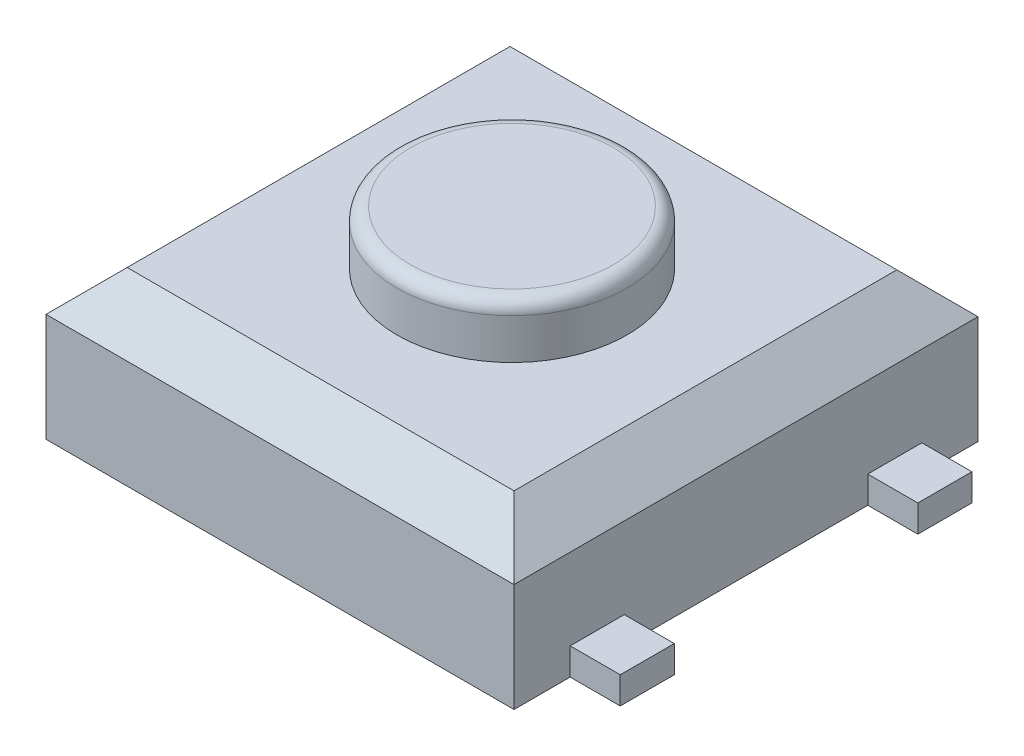
ISO-10303-21;
HEADER;
FILE_DESCRIPTION(('STEP AP214'),'2;1');
FILE_NAME('part.step','',(''),(''),'','','');
FILE_SCHEMA(('AUTOMOTIVE_DESIGN { 1 0 10303 214 1 1 1 1 }'));
ENDSEC;
DATA;
#1=APPLICATION_CONTEXT('core data for automotive mechanical design processes');
#2=APPLICATION_PROTOCOL_DEFINITION('international standard','automotive_design',2000,#1);
#3=PRODUCT_CONTEXT('',#1,'mechanical');
#4=PRODUCT('Part','Part','',(#3));
#5=PRODUCT_RELATED_PRODUCT_CATEGORY('part','',(#4));
#6=PRODUCT_DEFINITION_FORMATION('','',#4);
#7=PRODUCT_DEFINITION_CONTEXT('part definition',#1,'design');
#8=PRODUCT_DEFINITION('design','',#6,#7);
#9=PRODUCT_DEFINITION_SHAPE('','',#8);
#10=(LENGTH_UNIT() NAMED_UNIT(*) SI_UNIT(.MILLI.,.METRE.));
#11=(NAMED_UNIT(*) PLANE_ANGLE_UNIT() SI_UNIT($,.RADIAN.));
#12=(NAMED_UNIT(*) SI_UNIT($,.STERADIAN.) SOLID_ANGLE_UNIT());
#13=UNCERTAINTY_MEASURE_WITH_UNIT(LENGTH_MEASURE(1.E-05),#10,'distance_accuracy_value','');
#14=(GEOMETRIC_REPRESENTATION_CONTEXT(3) GLOBAL_UNCERTAINTY_ASSIGNED_CONTEXT((#13)) GLOBAL_UNIT_ASSIGNED_CONTEXT((#10,
#11,#12)) REPRESENTATION_CONTEXT('',''));
#15=CARTESIAN_POINT('',(0.,0.,0.));
#16=DIRECTION('',(0.,0.,1.));
#17=DIRECTION('',(1.,0.,0.));
#18=AXIS2_PLACEMENT_3D('',#15,#16,#17);
#19=CARTESIAN_POINT('',(0.,0.2,0.));
#20=DIRECTION('',(0.,1.,0.));
#21=DIRECTION('',(0.,0.,1.));
#22=AXIS2_PLACEMENT_3D('',#19,#20,#21);
#23=PLANE('',#22);
#24=DIRECTION('',(0.,0.,1.));
#25=VECTOR('',#24,1.);
#26=CARTESIAN_POINT('',(-1.73,0.2,-1.715));
#27=LINE('',#26,#25);
#28=CARTESIAN_POINT('',(-1.73,0.2,-1.3));
#29=VERTEX_POINT('',#28);
#30=CARTESIAN_POINT('',(-1.73,0.2,-0.9));
#31=VERTEX_POINT('',#30);
#32=EDGE_CURVE('E392',#29,#31,#27,.T.);
#33=ORIENTED_EDGE('',*,*,#32,.F.);
#34=DIRECTION('',(-1.,0.,0.));
#35=VECTOR('',#34,1.);
#36=CARTESIAN_POINT('',(0.,0.2,-1.3));
#37=LINE('',#36,#35);
#38=CARTESIAN_POINT('',(-2.1,0.2,-1.3));
#39=VERTEX_POINT('',#38);
#40=EDGE_CURVE('E286',#29,#39,#37,.T.);
#41=ORIENTED_EDGE('',*,*,#40,.T.);
#42=DIRECTION('',(0.,0.,1.));
#43=VECTOR('',#42,1.);
#44=CARTESIAN_POINT('',(-2.1,0.2,0.));
#45=LINE('',#44,#43);
#46=CARTESIAN_POINT('',(-2.1,0.2,-0.9));
#47=VERTEX_POINT('',#46);
#48=EDGE_CURVE('E288',#39,#47,#45,.T.);
#49=ORIENTED_EDGE('',*,*,#48,.T.);
#50=DIRECTION('',(-1.,0.,0.));
#51=VECTOR('',#50,1.);
#52=CARTESIAN_POINT('',(0.,0.2,-0.9));
#53=LINE('',#52,#51);
#54=EDGE_CURVE('E290',#31,#47,#53,.T.);
#55=ORIENTED_EDGE('',*,*,#54,.F.);
#56=EDGE_LOOP('',(#33,#41,#49,#55));
#57=FACE_BOUND('',#56,.T.);
#58=ADVANCED_FACE('F99',(#57),#23,.T.);
#59=CARTESIAN_POINT('',(-1.73,0.2,0.9));
#60=VERTEX_POINT('',#59);
#61=CARTESIAN_POINT('',(-1.73,0.2,1.3));
#62=VERTEX_POINT('',#61);
#63=EDGE_CURVE('E258',#60,#62,#27,.T.);
#64=ORIENTED_EDGE('',*,*,#63,.F.);
#65=DIRECTION('',(-1.,0.,0.));
#66=VECTOR('',#65,1.);
#67=CARTESIAN_POINT('',(0.,0.2,0.9));
#68=LINE('',#67,#66);
#69=CARTESIAN_POINT('',(-2.1,0.2,0.9));
#70=VERTEX_POINT('',#69);
#71=EDGE_CURVE('E293',#60,#70,#68,.T.);
#72=ORIENTED_EDGE('',*,*,#71,.T.);
#73=DIRECTION('',(0.,0.,1.));
#74=VECTOR('',#73,1.);
#75=CARTESIAN_POINT('',(-2.1,0.2,0.));
#76=LINE('',#75,#74);
#77=CARTESIAN_POINT('',(-2.1,0.2,1.3));
#78=VERTEX_POINT('',#77);
#79=EDGE_CURVE('E295',#70,#78,#76,.T.);
#80=ORIENTED_EDGE('',*,*,#79,.T.);
#81=DIRECTION('',(-1.,0.,0.));
#82=VECTOR('',#81,1.);
#83=CARTESIAN_POINT('',(0.,0.2,1.3));
#84=LINE('',#83,#82);
#85=EDGE_CURVE('E297',#62,#78,#84,.T.);
#86=ORIENTED_EDGE('',*,*,#85,.F.);
#87=EDGE_LOOP('',(#64,#72,#80,#86));
#88=FACE_BOUND('',#87,.T.);
#89=ADVANCED_FACE('F434',(#88),#23,.T.);
#90=DIRECTION('',(0.,0.,-1.));
#91=VECTOR('',#90,1.);
#92=CARTESIAN_POINT('',(1.73,0.2,-1.715));
#93=LINE('',#92,#91);
#94=CARTESIAN_POINT('',(1.73,0.2,1.3));
#95=VERTEX_POINT('',#94);
#96=CARTESIAN_POINT('',(1.73,0.2,0.9));
#97=VERTEX_POINT('',#96);
#98=EDGE_CURVE('E249',#95,#97,#93,.T.);
#99=ORIENTED_EDGE('',*,*,#98,.F.);
#100=DIRECTION('',(1.,0.,0.));
#101=VECTOR('',#100,1.);
#102=CARTESIAN_POINT('',(0.,0.2,1.3));
#103=LINE('',#102,#101);
#104=CARTESIAN_POINT('',(2.1,0.2,1.3));
#105=VERTEX_POINT('',#104);
#106=EDGE_CURVE('E254',#95,#105,#103,.T.);
#107=ORIENTED_EDGE('',*,*,#106,.T.);
#108=DIRECTION('',(0.,0.,1.));
#109=VECTOR('',#108,1.);
#110=CARTESIAN_POINT('',(2.1,0.2,0.));
#111=LINE('',#110,#109);
#112=CARTESIAN_POINT('',(2.1,0.2,0.9));
#113=VERTEX_POINT('',#112);
#114=EDGE_CURVE('E274',#113,#105,#111,.T.);
#115=ORIENTED_EDGE('',*,*,#114,.F.);
#116=DIRECTION('',(1.,0.,0.));
#117=VECTOR('',#116,1.);
#118=CARTESIAN_POINT('',(0.,0.2,0.9));
#119=LINE('',#118,#117);
#120=EDGE_CURVE('E257',#97,#113,#119,.T.);
#121=ORIENTED_EDGE('',*,*,#120,.F.);
#122=EDGE_LOOP('',(#99,#107,#115,#121));
#123=FACE_BOUND('',#122,.T.);
#124=ADVANCED_FACE('F251',(#123),#23,.T.);
#125=CARTESIAN_POINT('',(0.,0.2,1.715));
#126=DIRECTION('',(0.,0.,-1.));
#127=DIRECTION('',(-1.,0.,0.));
#128=AXIS2_PLACEMENT_3D('',#125,#126,#127);
#129=PLANE('',#128);
#130=DIRECTION('',(0.,-1.,0.));
#131=VECTOR('',#130,1.);
#132=CARTESIAN_POINT('',(1.73,0.2,1.715));
#133=LINE('',#132,#131);
#134=CARTESIAN_POINT('',(1.73,0.799999999999999,1.715));
#135=VERTEX_POINT('',#134);
#136=CARTESIAN_POINT('',(1.73,0.,1.715));
#137=VERTEX_POINT('',#136);
#138=EDGE_CURVE('E269',#135,#137,#133,.T.);
#139=ORIENTED_EDGE('',*,*,#138,.F.);
#140=DIRECTION('',(-1.,0.,0.));
#141=VECTOR('',#140,1.);
#142=CARTESIAN_POINT('',(-1.73,0.799999999999999,1.715));
#143=LINE('',#142,#141);
#144=CARTESIAN_POINT('',(-1.73,0.799999999999999,1.715));
#145=VERTEX_POINT('',#144);
#146=EDGE_CURVE('E114',#135,#145,#143,.T.);
#147=ORIENTED_EDGE('',*,*,#146,.T.);
#148=DIRECTION('',(0.,-1.,0.));
#149=VECTOR('',#148,1.);
#150=CARTESIAN_POINT('',(-1.73,0.2,1.715));
#151=LINE('',#150,#149);
#152=CARTESIAN_POINT('',(-1.73,0.,1.715));
#153=VERTEX_POINT('',#152);
#154=EDGE_CURVE('E300',#145,#153,#151,.T.);
#155=ORIENTED_EDGE('',*,*,#154,.T.);
#156=DIRECTION('',(1.,0.,0.));
#157=VECTOR('',#156,1.);
#158=CARTESIAN_POINT('',(0.,0.,1.715));
#159=LINE('',#158,#157);
#160=EDGE_CURVE('E301',#153,#137,#159,.T.);
#161=ORIENTED_EDGE('',*,*,#160,.T.);
#162=EDGE_LOOP('',(#139,#147,#155,#161));
#163=FACE_BOUND('',#162,.T.);
#164=ADVANCED_FACE('F513',(#163),#129,.F.);
#165=CARTESIAN_POINT('',(0.,0.2,1.3));
#166=DIRECTION('',(0.,0.,-1.));
#167=DIRECTION('',(-1.,0.,0.));
#168=AXIS2_PLACEMENT_3D('',#165,#166,#167);
#169=PLANE('',#168);
#170=DIRECTION('',(1.,0.,0.));
#171=VECTOR('',#170,1.);
#172=CARTESIAN_POINT('',(0.,0.,1.3));
#173=LINE('',#172,#171);
#174=CARTESIAN_POINT('',(1.73,0.,1.3));
#175=VERTEX_POINT('',#174);
#176=CARTESIAN_POINT('',(2.1,0.,1.3));
#177=VERTEX_POINT('',#176);
#178=EDGE_CURVE('E306',#175,#177,#173,.T.);
#179=ORIENTED_EDGE('',*,*,#178,.T.);
#180=DIRECTION('',(0.,-1.,0.));
#181=VECTOR('',#180,1.);
#182=CARTESIAN_POINT('',(2.1,0.2,1.3));
#183=LINE('',#182,#181);
#184=EDGE_CURVE('E270',#105,#177,#183,.T.);
#185=ORIENTED_EDGE('',*,*,#184,.F.);
#186=ORIENTED_EDGE('',*,*,#106,.F.);
#187=DIRECTION('',(0.,-1.,0.));
#188=VECTOR('',#187,1.);
#189=CARTESIAN_POINT('',(1.73,0.2,1.3));
#190=LINE('',#189,#188);
#191=EDGE_CURVE('E262',#95,#175,#190,.T.);
#192=ORIENTED_EDGE('',*,*,#191,.T.);
#193=EDGE_LOOP('',(#179,#185,#186,#192));
#194=FACE_BOUND('',#193,.T.);
#195=ADVANCED_FACE('F272',(#194),#169,.F.);
#196=CARTESIAN_POINT('',(2.1,0.2,0.));
#197=DIRECTION('',(1.,0.,0.));
#198=DIRECTION('',(0.,0.,-1.));
#199=AXIS2_PLACEMENT_3D('',#196,#197,#198);
#200=PLANE('',#199);
#201=DIRECTION('',(0.,0.,1.));
#202=VECTOR('',#201,1.);
#203=CARTESIAN_POINT('',(2.1,0.,0.));
#204=LINE('',#203,#202);
#205=CARTESIAN_POINT('',(2.1,0.,0.9));
#206=VERTEX_POINT('',#205);
#207=EDGE_CURVE('E310',#206,#177,#204,.T.);
#208=ORIENTED_EDGE('',*,*,#207,.F.);
#209=DIRECTION('',(0.,-1.,0.));
#210=VECTOR('',#209,1.);
#211=CARTESIAN_POINT('',(2.1,0.2,0.9));
#212=LINE('',#211,#210);
#213=EDGE_CURVE('E360',#113,#206,#212,.T.);
#214=ORIENTED_EDGE('',*,*,#213,.F.);
#215=ORIENTED_EDGE('',*,*,#114,.T.);
#216=ORIENTED_EDGE('',*,*,#184,.T.);
#217=EDGE_LOOP('',(#208,#214,#215,#216));
#218=FACE_BOUND('',#217,.T.);
#219=ADVANCED_FACE('F539',(#218),#200,.T.);
#220=CARTESIAN_POINT('',(0.,0.2,0.9));
#221=DIRECTION('',(0.,0.,-1.));
#222=DIRECTION('',(-1.,0.,0.));
#223=AXIS2_PLACEMENT_3D('',#220,#221,#222);
#224=PLANE('',#223);
#225=DIRECTION('',(1.,0.,0.));
#226=VECTOR('',#225,1.);
#227=CARTESIAN_POINT('',(0.,0.,0.9));
#228=LINE('',#227,#226);
#229=CARTESIAN_POINT('',(1.73,0.,0.9));
#230=VERTEX_POINT('',#229);
#231=EDGE_CURVE('E313',#230,#206,#228,.T.);
#232=ORIENTED_EDGE('',*,*,#231,.F.);
#233=DIRECTION('',(0.,-1.,0.));
#234=VECTOR('',#233,1.);
#235=CARTESIAN_POINT('',(1.73,0.2,0.9));
#236=LINE('',#235,#234);
#237=EDGE_CURVE('E358',#97,#230,#236,.T.);
#238=ORIENTED_EDGE('',*,*,#237,.F.);
#239=ORIENTED_EDGE('',*,*,#120,.T.);
#240=ORIENTED_EDGE('',*,*,#213,.T.);
#241=EDGE_LOOP('',(#232,#238,#239,#240));
#242=FACE_BOUND('',#241,.T.);
#243=ADVANCED_FACE('F542',(#242),#224,.T.);
#244=CARTESIAN_POINT('',(1.73,0.2,0.));
#245=DIRECTION('',(-1.,0.,0.));
#246=DIRECTION('',(0.,0.,1.));
#247=AXIS2_PLACEMENT_3D('',#244,#245,#246);
#248=PLANE('',#247);
#249=DIRECTION('',(0.,-1.,0.));
#250=VECTOR('',#249,1.);
#251=CARTESIAN_POINT('',(1.73,0.2,-1.715));
#252=LINE('',#251,#250);
#253=CARTESIAN_POINT('',(1.73,0.799999999999999,-1.715));
#254=VERTEX_POINT('',#253);
#255=CARTESIAN_POINT('',(1.73,0.,-1.715));
#256=VERTEX_POINT('',#255);
#257=EDGE_CURVE('E356',#254,#256,#252,.T.);
#258=ORIENTED_EDGE('',*,*,#257,.F.);
#259=DIRECTION('',(0.,0.,1.));
#260=VECTOR('',#259,1.);
#261=CARTESIAN_POINT('',(1.73,0.799999999999999,1.715));
#262=LINE('',#261,#260);
#263=EDGE_CURVE('E122',#254,#135,#262,.T.);
#264=ORIENTED_EDGE('',*,*,#263,.T.);
#265=ORIENTED_EDGE('',*,*,#138,.T.);
#266=DIRECTION('',(0.,0.,-1.));
#267=VECTOR('',#266,1.);
#268=CARTESIAN_POINT('',(1.73,0.,0.));
#269=LINE('',#268,#267);
#270=EDGE_CURVE('E265',#137,#175,#269,.T.);
#271=ORIENTED_EDGE('',*,*,#270,.T.);
#272=ORIENTED_EDGE('',*,*,#191,.F.);
#273=ORIENTED_EDGE('',*,*,#98,.T.);
#274=ORIENTED_EDGE('',*,*,#237,.T.);
#275=CARTESIAN_POINT('',(1.73,0.,-0.9));
#276=VERTEX_POINT('',#275);
#277=EDGE_CURVE('E308',#230,#276,#269,.T.);
#278=ORIENTED_EDGE('',*,*,#277,.T.);
#279=DIRECTION('',(0.,-1.,0.));
#280=VECTOR('',#279,1.);
#281=CARTESIAN_POINT('',(1.73,0.2,-0.9));
#282=LINE('',#281,#280);
#283=CARTESIAN_POINT('',(1.73,0.2,-0.9));
#284=VERTEX_POINT('',#283);
#285=EDGE_CURVE('E364',#284,#276,#282,.T.);
#286=ORIENTED_EDGE('',*,*,#285,.F.);
#287=CARTESIAN_POINT('',(1.73,0.2,-1.3));
#288=VERTEX_POINT('',#287);
#289=EDGE_CURVE('E259',#284,#288,#93,.T.);
#290=ORIENTED_EDGE('',*,*,#289,.T.);
#291=DIRECTION('',(0.,-1.,0.));
#292=VECTOR('',#291,1.);
#293=CARTESIAN_POINT('',(1.73,0.2,-1.3));
#294=LINE('',#293,#292);
#295=CARTESIAN_POINT('',(1.73,0.,-1.3));
#296=VERTEX_POINT('',#295);
#297=EDGE_CURVE('E366',#288,#296,#294,.T.);
#298=ORIENTED_EDGE('',*,*,#297,.T.);
#299=EDGE_CURVE('E307',#296,#256,#269,.T.);
#300=ORIENTED_EDGE('',*,*,#299,.T.);
#301=EDGE_LOOP('',(#258,#264,#265,#271,#272,#273,#274,#278,#286,#290,#298,#300));
#302=FACE_BOUND('',#301,.T.);
#303=ADVANCED_FACE('F263',(#302),#248,.F.);
#304=CARTESIAN_POINT('',(0.,0.2,-1.715));
#305=DIRECTION('',(0.,0.,-1.));
#306=DIRECTION('',(-1.,0.,0.));
#307=AXIS2_PLACEMENT_3D('',#304,#305,#306);
#308=PLANE('',#307);
#309=DIRECTION('',(0.,-1.,0.));
#310=VECTOR('',#309,1.);
#311=CARTESIAN_POINT('',(-1.73,0.2,-1.715));
#312=LINE('',#311,#310);
#313=CARTESIAN_POINT('',(-1.73,0.799999999999999,-1.715));
#314=VERTEX_POINT('',#313);
#315=CARTESIAN_POINT('',(-1.73,0.,-1.715));
#316=VERTEX_POINT('',#315);
#317=EDGE_CURVE('E354',#314,#316,#312,.T.);
#318=ORIENTED_EDGE('',*,*,#317,.F.);
#319=DIRECTION('',(1.,0.,0.));
#320=VECTOR('',#319,1.);
#321=CARTESIAN_POINT('',(0.,0.799999999999999,-1.715));
#322=LINE('',#321,#320);
#323=EDGE_CURVE('E399',#314,#254,#322,.T.);
#324=ORIENTED_EDGE('',*,*,#323,.T.);
#325=ORIENTED_EDGE('',*,*,#257,.T.);
#326=DIRECTION('',(1.,0.,0.));
#327=VECTOR('',#326,1.);
#328=CARTESIAN_POINT('',(0.,0.,-1.715));
#329=LINE('',#328,#327);
#330=EDGE_CURVE('E316',#316,#256,#329,.T.);
#331=ORIENTED_EDGE('',*,*,#330,.F.);
#332=EDGE_LOOP('',(#318,#324,#325,#331));
#333=FACE_BOUND('',#332,.T.);
#334=ADVANCED_FACE('F461',(#333),#308,.T.);
#335=CARTESIAN_POINT('',(0.,0.2,-1.3));
#336=DIRECTION('',(0.,0.,1.));
#337=DIRECTION('',(1.,0.,0.));
#338=AXIS2_PLACEMENT_3D('',#335,#336,#337);
#339=PLANE('',#338);
#340=DIRECTION('',(-1.,0.,0.));
#341=VECTOR('',#340,1.);
#342=CARTESIAN_POINT('',(0.,0.,-1.3));
#343=LINE('',#342,#341);
#344=CARTESIAN_POINT('',(-1.73,0.,-1.3));
#345=VERTEX_POINT('',#344);
#346=CARTESIAN_POINT('',(-2.1,0.,-1.3));
#347=VERTEX_POINT('',#346);
#348=EDGE_CURVE('E320',#345,#347,#343,.T.);
#349=ORIENTED_EDGE('',*,*,#348,.T.);
#350=DIRECTION('',(0.,-1.,0.));
#351=VECTOR('',#350,1.);
#352=CARTESIAN_POINT('',(-2.1,0.2,-1.3));
#353=LINE('',#352,#351);
#354=EDGE_CURVE('E349',#39,#347,#353,.T.);
#355=ORIENTED_EDGE('',*,*,#354,.F.);
#356=ORIENTED_EDGE('',*,*,#40,.F.);
#357=DIRECTION('',(0.,-1.,0.));
#358=VECTOR('',#357,1.);
#359=CARTESIAN_POINT('',(-1.73,0.2,-1.3));
#360=LINE('',#359,#358);
#361=EDGE_CURVE('E352',#29,#345,#360,.T.);
#362=ORIENTED_EDGE('',*,*,#361,.T.);
#363=EDGE_LOOP('',(#349,#355,#356,#362));
#364=FACE_BOUND('',#363,.T.);
#365=ADVANCED_FACE('F473',(#364),#339,.F.);
#366=CARTESIAN_POINT('',(-2.1,0.2,0.));
#367=DIRECTION('',(1.,0.,0.));
#368=DIRECTION('',(0.,0.,-1.));
#369=AXIS2_PLACEMENT_3D('',#366,#367,#368);
#370=PLANE('',#369);
#371=DIRECTION('',(0.,0.,1.));
#372=VECTOR('',#371,1.);
#373=CARTESIAN_POINT('',(-2.1,0.,0.));
#374=LINE('',#373,#372);
#375=CARTESIAN_POINT('',(-2.1,0.,-0.9));
#376=VERTEX_POINT('',#375);
#377=EDGE_CURVE('E322',#347,#376,#374,.T.);
#378=ORIENTED_EDGE('',*,*,#377,.T.);
#379=DIRECTION('',(0.,-1.,0.));
#380=VECTOR('',#379,1.);
#381=CARTESIAN_POINT('',(-2.1,0.2,-0.9));
#382=LINE('',#381,#380);
#383=EDGE_CURVE('E347',#47,#376,#382,.T.);
#384=ORIENTED_EDGE('',*,*,#383,.F.);
#385=ORIENTED_EDGE('',*,*,#48,.F.);
#386=ORIENTED_EDGE('',*,*,#354,.T.);
#387=EDGE_LOOP('',(#378,#384,#385,#386));
#388=FACE_BOUND('',#387,.T.);
#389=ADVANCED_FACE('F553',(#388),#370,.F.);
#390=CARTESIAN_POINT('',(0.,0.2,-0.9));
#391=DIRECTION('',(0.,0.,1.));
#392=DIRECTION('',(1.,0.,0.));
#393=AXIS2_PLACEMENT_3D('',#390,#391,#392);
#394=PLANE('',#393);
#395=DIRECTION('',(-1.,0.,0.));
#396=VECTOR('',#395,1.);
#397=CARTESIAN_POINT('',(0.,0.,-0.9));
#398=LINE('',#397,#396);
#399=CARTESIAN_POINT('',(-1.73,0.,-0.9));
#400=VERTEX_POINT('',#399);
#401=EDGE_CURVE('E325',#400,#376,#398,.T.);
#402=ORIENTED_EDGE('',*,*,#401,.F.);
#403=DIRECTION('',(0.,-1.,0.));
#404=VECTOR('',#403,1.);
#405=CARTESIAN_POINT('',(-1.73,0.2,-0.9));
#406=LINE('',#405,#404);
#407=EDGE_CURVE('E345',#31,#400,#406,.T.);
#408=ORIENTED_EDGE('',*,*,#407,.F.);
#409=ORIENTED_EDGE('',*,*,#54,.T.);
#410=ORIENTED_EDGE('',*,*,#383,.T.);
#411=EDGE_LOOP('',(#402,#408,#409,#410));
#412=FACE_BOUND('',#411,.T.);
#413=ADVANCED_FACE('F480',(#412),#394,.T.);
#414=CARTESIAN_POINT('',(0.,0.2,0.9));
#415=DIRECTION('',(0.,0.,1.));
#416=DIRECTION('',(1.,0.,0.));
#417=AXIS2_PLACEMENT_3D('',#414,#415,#416);
#418=PLANE('',#417);
#419=DIRECTION('',(-1.,0.,0.));
#420=VECTOR('',#419,1.);
#421=CARTESIAN_POINT('',(0.,0.,0.9));
#422=LINE('',#421,#420);
#423=CARTESIAN_POINT('',(-1.73,0.,0.9));
#424=VERTEX_POINT('',#423);
#425=CARTESIAN_POINT('',(-2.1,0.,0.9));
#426=VERTEX_POINT('',#425);
#427=EDGE_CURVE('E328',#424,#426,#422,.T.);
#428=ORIENTED_EDGE('',*,*,#427,.T.);
#429=DIRECTION('',(0.,-1.,0.));
#430=VECTOR('',#429,1.);
#431=CARTESIAN_POINT('',(-2.1,0.2,0.9));
#432=LINE('',#431,#430);
#433=EDGE_CURVE('E340',#70,#426,#432,.T.);
#434=ORIENTED_EDGE('',*,*,#433,.F.);
#435=ORIENTED_EDGE('',*,*,#71,.F.);
#436=DIRECTION('',(0.,-1.,0.));
#437=VECTOR('',#436,1.);
#438=CARTESIAN_POINT('',(-1.73,0.2,0.9));
#439=LINE('',#438,#437);
#440=EDGE_CURVE('E343',#60,#424,#439,.T.);
#441=ORIENTED_EDGE('',*,*,#440,.T.);
#442=EDGE_LOOP('',(#428,#434,#435,#441));
#443=FACE_BOUND('',#442,.T.);
#444=ADVANCED_FACE('F484',(#443),#418,.F.);
#445=CARTESIAN_POINT('',(-2.1,0.2,0.));
#446=DIRECTION('',(1.,0.,0.));
#447=DIRECTION('',(0.,0.,-1.));
#448=AXIS2_PLACEMENT_3D('',#445,#446,#447);
#449=PLANE('',#448);
#450=DIRECTION('',(0.,0.,1.));
#451=VECTOR('',#450,1.);
#452=CARTESIAN_POINT('',(-2.1,0.,0.));
#453=LINE('',#452,#451);
#454=CARTESIAN_POINT('',(-2.1,0.,1.3));
#455=VERTEX_POINT('',#454);
#456=EDGE_CURVE('E330',#426,#455,#453,.T.);
#457=ORIENTED_EDGE('',*,*,#456,.T.);
#458=DIRECTION('',(0.,-1.,0.));
#459=VECTOR('',#458,1.);
#460=CARTESIAN_POINT('',(-2.1,0.2,1.3));
#461=LINE('',#460,#459);
#462=EDGE_CURVE('E338',#78,#455,#461,.T.);
#463=ORIENTED_EDGE('',*,*,#462,.F.);
#464=ORIENTED_EDGE('',*,*,#79,.F.);
#465=ORIENTED_EDGE('',*,*,#433,.T.);
#466=EDGE_LOOP('',(#457,#463,#464,#465));
#467=FACE_BOUND('',#466,.T.);
#468=ADVANCED_FACE('F486',(#467),#449,.F.);
#469=CARTESIAN_POINT('',(0.,0.2,1.3));
#470=DIRECTION('',(0.,0.,1.));
#471=DIRECTION('',(1.,0.,0.));
#472=AXIS2_PLACEMENT_3D('',#469,#470,#471);
#473=PLANE('',#472);
#474=DIRECTION('',(-1.,0.,0.));
#475=VECTOR('',#474,1.);
#476=CARTESIAN_POINT('',(0.,0.,1.3));
#477=LINE('',#476,#475);
#478=CARTESIAN_POINT('',(-1.73,0.,1.3));
#479=VERTEX_POINT('',#478);
#480=EDGE_CURVE('E279',#479,#455,#477,.T.);
#481=ORIENTED_EDGE('',*,*,#480,.F.);
#482=DIRECTION('',(0.,-1.,0.));
#483=VECTOR('',#482,1.);
#484=CARTESIAN_POINT('',(-1.73,0.2,1.3));
#485=LINE('',#484,#483);
#486=EDGE_CURVE('E336',#62,#479,#485,.T.);
#487=ORIENTED_EDGE('',*,*,#486,.F.);
#488=ORIENTED_EDGE('',*,*,#85,.T.);
#489=ORIENTED_EDGE('',*,*,#462,.T.);
#490=EDGE_LOOP('',(#481,#487,#488,#489));
#491=FACE_BOUND('',#490,.T.);
#492=ADVANCED_FACE('F439',(#491),#473,.T.);
#493=CARTESIAN_POINT('',(-1.73,0.2,0.));
#494=DIRECTION('',(-1.,0.,0.));
#495=DIRECTION('',(0.,0.,1.));
#496=AXIS2_PLACEMENT_3D('',#493,#494,#495);
#497=PLANE('',#496);
#498=ORIENTED_EDGE('',*,*,#154,.F.);
#499=DIRECTION('',(0.,0.,-1.));
#500=VECTOR('',#499,1.);
#501=CARTESIAN_POINT('',(-1.73,0.799999999999999,0.));
#502=LINE('',#501,#500);
#503=EDGE_CURVE('E404',#145,#314,#502,.T.);
#504=ORIENTED_EDGE('',*,*,#503,.T.);
#505=ORIENTED_EDGE('',*,*,#317,.T.);
#506=DIRECTION('',(0.,0.,-1.));
#507=VECTOR('',#506,1.);
#508=CARTESIAN_POINT('',(-1.73,0.,0.));
#509=LINE('',#508,#507);
#510=EDGE_CURVE('E282',#345,#316,#509,.T.);
#511=ORIENTED_EDGE('',*,*,#510,.F.);
#512=ORIENTED_EDGE('',*,*,#361,.F.);
#513=ORIENTED_EDGE('',*,*,#32,.T.);
#514=ORIENTED_EDGE('',*,*,#407,.T.);
#515=EDGE_CURVE('E281',#424,#400,#509,.T.);
#516=ORIENTED_EDGE('',*,*,#515,.F.);
#517=ORIENTED_EDGE('',*,*,#440,.F.);
#518=ORIENTED_EDGE('',*,*,#63,.T.);
#519=ORIENTED_EDGE('',*,*,#486,.T.);
#520=EDGE_CURVE('E275',#153,#479,#509,.T.);
#521=ORIENTED_EDGE('',*,*,#520,.F.);
#522=EDGE_LOOP('',(#498,#504,#505,#511,#512,#513,#514,#516,#517,#518,#519,#521));
#523=FACE_BOUND('',#522,.T.);
#524=ADVANCED_FACE('F427',(#523),#497,.T.);
#525=ORIENTED_EDGE('',*,*,#289,.F.);
#526=DIRECTION('',(1.,0.,0.));
#527=VECTOR('',#526,1.);
#528=CARTESIAN_POINT('',(1.73,0.2,-0.9));
#529=LINE('',#528,#527);
#530=CARTESIAN_POINT('',(2.1,0.2,-0.9));
#531=VERTEX_POINT('',#530);
#532=EDGE_CURVE('E375',#284,#531,#529,.T.);
#533=ORIENTED_EDGE('',*,*,#532,.T.);
#534=DIRECTION('',(0.,0.,1.));
#535=VECTOR('',#534,1.);
#536=CARTESIAN_POINT('',(2.1,0.2,-1.3));
#537=LINE('',#536,#535);
#538=CARTESIAN_POINT('',(2.1,0.2,-1.3));
#539=VERTEX_POINT('',#538);
#540=EDGE_CURVE('E371',#539,#531,#537,.T.);
#541=ORIENTED_EDGE('',*,*,#540,.F.);
#542=DIRECTION('',(1.,0.,0.));
#543=VECTOR('',#542,1.);
#544=CARTESIAN_POINT('',(1.73,0.2,-1.3));
#545=LINE('',#544,#543);
#546=EDGE_CURVE('E368',#288,#539,#545,.T.);
#547=ORIENTED_EDGE('',*,*,#546,.F.);
#548=EDGE_LOOP('',(#525,#533,#541,#547));
#549=FACE_BOUND('',#548,.T.);
#550=ADVANCED_FACE('F497',(#549),#23,.T.);
#551=CARTESIAN_POINT('',(0.,0.,0.));
#552=DIRECTION('',(0.,1.,0.));
#553=DIRECTION('',(0.,0.,1.));
#554=AXIS2_PLACEMENT_3D('',#551,#552,#553);
#555=PLANE('',#554);
#556=ORIENTED_EDGE('',*,*,#160,.F.);
#557=ORIENTED_EDGE('',*,*,#520,.T.);
#558=ORIENTED_EDGE('',*,*,#480,.T.);
#559=ORIENTED_EDGE('',*,*,#456,.F.);
#560=ORIENTED_EDGE('',*,*,#427,.F.);
#561=ORIENTED_EDGE('',*,*,#515,.T.);
#562=ORIENTED_EDGE('',*,*,#401,.T.);
#563=ORIENTED_EDGE('',*,*,#377,.F.);
#564=ORIENTED_EDGE('',*,*,#348,.F.);
#565=ORIENTED_EDGE('',*,*,#510,.T.);
#566=ORIENTED_EDGE('',*,*,#330,.T.);
#567=ORIENTED_EDGE('',*,*,#299,.F.);
#568=DIRECTION('',(1.,0.,0.));
#569=VECTOR('',#568,1.);
#570=CARTESIAN_POINT('',(1.73,0.,-1.3));
#571=LINE('',#570,#569);
#572=CARTESIAN_POINT('',(2.1,0.,-1.3));
#573=VERTEX_POINT('',#572);
#574=EDGE_CURVE('E378',#296,#573,#571,.T.);
#575=ORIENTED_EDGE('',*,*,#574,.T.);
#576=DIRECTION('',(0.,0.,1.));
#577=VECTOR('',#576,1.);
#578=CARTESIAN_POINT('',(2.1,0.,-1.3));
#579=LINE('',#578,#577);
#580=CARTESIAN_POINT('',(2.1,0.,-0.9));
#581=VERTEX_POINT('',#580);
#582=EDGE_CURVE('E381',#573,#581,#579,.T.);
#583=ORIENTED_EDGE('',*,*,#582,.T.);
#584=DIRECTION('',(1.,0.,0.));
#585=VECTOR('',#584,1.);
#586=CARTESIAN_POINT('',(1.73,0.,-0.9));
#587=LINE('',#586,#585);
#588=EDGE_CURVE('E372',#276,#581,#587,.T.);
#589=ORIENTED_EDGE('',*,*,#588,.F.);
#590=ORIENTED_EDGE('',*,*,#277,.F.);
#591=ORIENTED_EDGE('',*,*,#231,.T.);
#592=ORIENTED_EDGE('',*,*,#207,.T.);
#593=ORIENTED_EDGE('',*,*,#178,.F.);
#594=ORIENTED_EDGE('',*,*,#270,.F.);
#595=EDGE_LOOP('',(#556,#557,#558,#559,#560,#561,#562,#563,#564,#565,#566,#567,#575,#583,#589,
#590,#591,#592,#593,#594));
#596=FACE_BOUND('',#595,.T.);
#597=ADVANCED_FACE('F443',(#596),#555,.F.);
#598=CARTESIAN_POINT('',(1.73,0.2,-0.9));
#599=DIRECTION('',(0.,0.,-1.));
#600=DIRECTION('',(-1.,0.,0.));
#601=AXIS2_PLACEMENT_3D('',#598,#599,#600);
#602=PLANE('',#601);
#603=ORIENTED_EDGE('',*,*,#588,.T.);
#604=DIRECTION('',(0.,-1.,0.));
#605=VECTOR('',#604,1.);
#606=CARTESIAN_POINT('',(2.1,0.2,-0.9));
#607=LINE('',#606,#605);
#608=EDGE_CURVE('E304',#531,#581,#607,.T.);
#609=ORIENTED_EDGE('',*,*,#608,.F.);
#610=ORIENTED_EDGE('',*,*,#532,.F.);
#611=ORIENTED_EDGE('',*,*,#285,.T.);
#612=EDGE_LOOP('',(#603,#609,#610,#611));
#613=FACE_BOUND('',#612,.T.);
#614=ADVANCED_FACE('F509',(#613),#602,.F.);
#615=CARTESIAN_POINT('',(2.1,0.2,-1.3));
#616=DIRECTION('',(1.,0.,0.));
#617=DIRECTION('',(0.,0.,-1.));
#618=AXIS2_PLACEMENT_3D('',#615,#616,#617);
#619=PLANE('',#618);
#620=ORIENTED_EDGE('',*,*,#582,.F.);
#621=DIRECTION('',(0.,-1.,0.));
#622=VECTOR('',#621,1.);
#623=CARTESIAN_POINT('',(2.1,0.2,-1.3));
#624=LINE('',#623,#622);
#625=EDGE_CURVE('E377',#539,#573,#624,.T.);
#626=ORIENTED_EDGE('',*,*,#625,.F.);
#627=ORIENTED_EDGE('',*,*,#540,.T.);
#628=ORIENTED_EDGE('',*,*,#608,.T.);
#629=EDGE_LOOP('',(#620,#626,#627,#628));
#630=FACE_BOUND('',#629,.T.);
#631=ADVANCED_FACE('F519',(#630),#619,.T.);
#632=CARTESIAN_POINT('',(1.73,0.2,-1.3));
#633=DIRECTION('',(0.,0.,-1.));
#634=DIRECTION('',(-1.,0.,0.));
#635=AXIS2_PLACEMENT_3D('',#632,#633,#634);
#636=PLANE('',#635);
#637=ORIENTED_EDGE('',*,*,#574,.F.);
#638=ORIENTED_EDGE('',*,*,#297,.F.);
#639=ORIENTED_EDGE('',*,*,#546,.T.);
#640=ORIENTED_EDGE('',*,*,#625,.T.);
#641=EDGE_LOOP('',(#637,#638,#639,#640));
#642=FACE_BOUND('',#641,.T.);
#643=ADVANCED_FACE('F514',(#642),#636,.T.);
#644=CARTESIAN_POINT('',(0.,1.1,0.));
#645=DIRECTION('',(0.,1.,0.));
#646=DIRECTION('',(0.,0.,1.));
#647=AXIS2_PLACEMENT_3D('',#644,#645,#646);
#648=PLANE('',#647);
#649=CARTESIAN_POINT('',(0.,1.1,0.));
#650=DIRECTION('',(0.,1.,0.));
#651=DIRECTION('',(0.,0.,1.));
#652=AXIS2_PLACEMENT_3D('',#649,#650,#651);
#653=CIRCLE('',#652,0.85);
#654=CARTESIAN_POINT('',(0.,1.1,0.85));
#655=VERTEX_POINT('',#654);
#656=EDGE_CURVE('E406',#655,#655,#653,.T.);
#657=ORIENTED_EDGE('',*,*,#656,.F.);
#658=EDGE_LOOP('',(#657));
#659=FACE_BOUND('',#658,.T.);
#660=DIRECTION('',(0.,0.,-1.));
#661=VECTOR('',#660,1.);
#662=CARTESIAN_POINT('',(1.43,1.1,-1.715));
#663=LINE('',#662,#661);
#664=CARTESIAN_POINT('',(1.43,1.1,1.415));
#665=VERTEX_POINT('',#664);
#666=CARTESIAN_POINT('',(1.43,1.1,-1.415));
#667=VERTEX_POINT('',#666);
#668=EDGE_CURVE('E394',#665,#667,#663,.T.);
#669=ORIENTED_EDGE('',*,*,#668,.T.);
#670=DIRECTION('',(-1.,0.,0.));
#671=VECTOR('',#670,1.);
#672=CARTESIAN_POINT('',(0.,1.1,-1.415));
#673=LINE('',#672,#671);
#674=CARTESIAN_POINT('',(-1.43,1.1,-1.415));
#675=VERTEX_POINT('',#674);
#676=EDGE_CURVE('E396',#667,#675,#673,.T.);
#677=ORIENTED_EDGE('',*,*,#676,.T.);
#678=DIRECTION('',(0.,0.,1.));
#679=VECTOR('',#678,1.);
#680=CARTESIAN_POINT('',(-1.43,1.1,0.));
#681=LINE('',#680,#679);
#682=CARTESIAN_POINT('',(-1.43,1.1,1.415));
#683=VERTEX_POINT('',#682);
#684=EDGE_CURVE('E389',#675,#683,#681,.T.);
#685=ORIENTED_EDGE('',*,*,#684,.T.);
#686=DIRECTION('',(1.,0.,0.));
#687=VECTOR('',#686,1.);
#688=CARTESIAN_POINT('',(1.73,1.1,1.415));
#689=LINE('',#688,#687);
#690=EDGE_CURVE('E391',#683,#665,#689,.T.);
#691=ORIENTED_EDGE('',*,*,#690,.T.);
#692=EDGE_LOOP('',(#669,#677,#685,#691));
#693=FACE_BOUND('',#692,.T.);
#694=ADVANCED_FACE('F510',(#659,#693),#648,.T.);
#695=CARTESIAN_POINT('',(0.,1.1,1.415));
#696=DIRECTION('',(0.,0.707106781186545,0.70710678118655));
#697=DIRECTION('',(-1.,0.,0.));
#698=AXIS2_PLACEMENT_3D('',#695,#696,#697);
#699=PLANE('',#698);
#700=DIRECTION('',(-0.577350269189625,-0.577350269189628,0.577350269189625));
#701=VECTOR('',#700,1.);
#702=CARTESIAN_POINT('',(-0.958333333333336,1.57166666666667,0.943333333333336));
#703=LINE('',#702,#701);
#704=EDGE_CURVE('E411',#145,#683,#703,.F.);
#705=ORIENTED_EDGE('',*,*,#704,.F.);
#706=ORIENTED_EDGE('',*,*,#146,.F.);
#707=DIRECTION('',(-0.577350269189625,0.577350269189628,-0.577350269189625));
#708=VECTOR('',#707,1.);
#709=CARTESIAN_POINT('',(0.953333333333336,1.57666666666667,0.938333333333336));
#710=LINE('',#709,#708);
#711=EDGE_CURVE('E382',#665,#135,#710,.F.);
#712=ORIENTED_EDGE('',*,*,#711,.F.);
#713=ORIENTED_EDGE('',*,*,#690,.F.);
#714=EDGE_LOOP('',(#705,#706,#712,#713));
#715=FACE_BOUND('',#714,.T.);
#716=ADVANCED_FACE('F449',(#715),#699,.T.);
#717=CARTESIAN_POINT('',(1.43,1.1,0.));
#718=DIRECTION('',(0.70710678118655,0.707106781186545,0.));
#719=DIRECTION('',(0.,0.,1.));
#720=AXIS2_PLACEMENT_3D('',#717,#718,#719);
#721=PLANE('',#720);
#722=ORIENTED_EDGE('',*,*,#711,.T.);
#723=ORIENTED_EDGE('',*,*,#263,.F.);
#724=DIRECTION('',(0.577350269189625,-0.577350269189628,-0.577350269189625));
#725=VECTOR('',#724,1.);
#726=CARTESIAN_POINT('',(0.958333333333336,1.57166666666667,-0.943333333333336));
#727=LINE('',#726,#725);
#728=EDGE_CURVE('E409',#667,#254,#727,.T.);
#729=ORIENTED_EDGE('',*,*,#728,.F.);
#730=ORIENTED_EDGE('',*,*,#668,.F.);
#731=EDGE_LOOP('',(#722,#723,#729,#730));
#732=FACE_BOUND('',#731,.T.);
#733=ADVANCED_FACE('F634',(#732),#721,.T.);
#734=CARTESIAN_POINT('',(-1.43,1.1,0.));
#735=DIRECTION('',(0.70710678118655,-0.707106781186545,0.));
#736=DIRECTION('',(0.,0.,1.));
#737=AXIS2_PLACEMENT_3D('',#734,#735,#736);
#738=PLANE('',#737);
#739=ORIENTED_EDGE('',*,*,#704,.T.);
#740=ORIENTED_EDGE('',*,*,#684,.F.);
#741=DIRECTION('',(-0.577350269189625,-0.577350269189628,-0.577350269189625));
#742=VECTOR('',#741,1.);
#743=CARTESIAN_POINT('',(-0.958333333333335,1.57166666666667,-0.943333333333336));
#744=LINE('',#743,#742);
#745=EDGE_CURVE('E407',#314,#675,#744,.F.);
#746=ORIENTED_EDGE('',*,*,#745,.F.);
#747=ORIENTED_EDGE('',*,*,#503,.F.);
#748=EDGE_LOOP('',(#739,#740,#746,#747));
#749=FACE_BOUND('',#748,.T.);
#750=ADVANCED_FACE('F454',(#749),#738,.F.);
#751=CARTESIAN_POINT('',(0.,1.1,-1.415));
#752=DIRECTION('',(0.,-0.707106781186545,0.70710678118655));
#753=DIRECTION('',(-1.,0.,0.));
#754=AXIS2_PLACEMENT_3D('',#751,#752,#753);
#755=PLANE('',#754);
#756=ORIENTED_EDGE('',*,*,#728,.T.);
#757=ORIENTED_EDGE('',*,*,#323,.F.);
#758=ORIENTED_EDGE('',*,*,#745,.T.);
#759=ORIENTED_EDGE('',*,*,#676,.F.);
#760=EDGE_LOOP('',(#756,#757,#758,#759));
#761=FACE_BOUND('',#760,.T.);
#762=ADVANCED_FACE('F458',(#761),#755,.F.);
#763=CARTESIAN_POINT('',(0.,1.5,0.));
#764=DIRECTION('',(0.,-1.,0.));
#765=DIRECTION('',(0.,0.,-1.));
#766=AXIS2_PLACEMENT_3D('',#763,#764,#765);
#767=CYLINDRICAL_SURFACE('',#766,0.85);
#768=CARTESIAN_POINT('',(0.,1.4,0.));
#769=DIRECTION('',(0.,1.,0.));
#770=DIRECTION('',(0.,0.,1.));
#771=AXIS2_PLACEMENT_3D('',#768,#769,#770);
#772=CIRCLE('',#771,0.85);
#773=CARTESIAN_POINT('',(0.,1.4,0.85));
#774=VERTEX_POINT('',#773);
#775=EDGE_CURVE('E12',#774,#774,#772,.F.);
#776=ORIENTED_EDGE('',*,*,#775,.T.);
#777=EDGE_LOOP('',(#776));
#778=FACE_BOUND('',#777,.T.);
#779=ORIENTED_EDGE('',*,*,#656,.T.);
#780=EDGE_LOOP('',(#779));
#781=FACE_BOUND('',#780,.T.);
#782=ADVANCED_FACE('F662',(#778,#781),#767,.T.);
#783=CARTESIAN_POINT('',(0.,1.5,0.));
#784=DIRECTION('',(0.,1.,0.));
#785=DIRECTION('',(0.,0.,1.));
#786=AXIS2_PLACEMENT_3D('',#783,#784,#785);
#787=PLANE('',#786);
#788=CARTESIAN_POINT('',(0.,1.5,0.));
#789=DIRECTION('',(0.,1.,0.));
#790=DIRECTION('',(0.,0.,1.));
#791=AXIS2_PLACEMENT_3D('',#788,#789,#790);
#792=CIRCLE('',#791,0.75);
#793=CARTESIAN_POINT('',(0.,1.5,0.75));
#794=VERTEX_POINT('',#793);
#795=EDGE_CURVE('E107',#794,#794,#792,.T.);
#796=ORIENTED_EDGE('',*,*,#795,.T.);
#797=EDGE_LOOP('',(#796));
#798=FACE_BOUND('',#797,.T.);
#799=ADVANCED_FACE('F677',(#798),#787,.T.);
#800=CARTESIAN_POINT('',(0.,1.4,0.));
#801=DIRECTION('',(0.,1.,0.));
#802=DIRECTION('',(0.,0.,1.));
#803=AXIS2_PLACEMENT_3D('',#800,#801,#802);
#804=TOROIDAL_SURFACE('',#803,0.75,0.1);
#805=ORIENTED_EDGE('',*,*,#775,.F.);
#806=EDGE_LOOP('',(#805));
#807=FACE_BOUND('',#806,.T.);
#808=ORIENTED_EDGE('',*,*,#795,.F.);
#809=EDGE_LOOP('',(#808));
#810=FACE_BOUND('',#809,.T.);
#811=ADVANCED_FACE('F101',(#807,#810),#804,.T.);
#812=CLOSED_SHELL('',(#58,#89,#124,#164,#195,#219,#243,#303,#334,#365,#389,#413,#444,#468,#492,
#524,#550,#597,#614,#631,#643,#694,#716,#733,#750,#762,#782,#799,#811));
#813=MANIFOLD_SOLID_BREP('B2',#812);
#814=ADVANCED_BREP_SHAPE_REPRESENTATION('',(#18,#813),#14);
#815=SHAPE_DEFINITION_REPRESENTATION(#9,#814);
ENDSEC;
END-ISO-10303-21;
